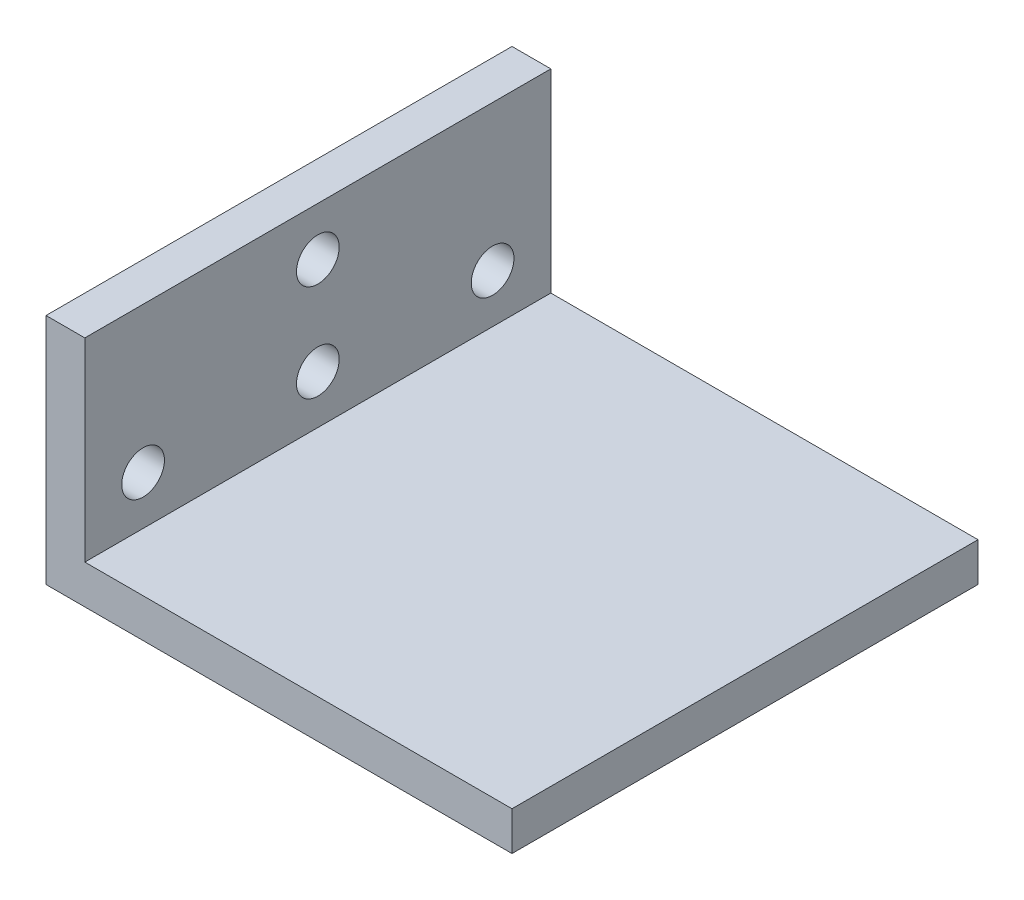
ISO-10303-21;
HEADER;
FILE_DESCRIPTION(('STEP AP214'),'2;1');
FILE_NAME('part.step','',(''),(''),'','','');
FILE_SCHEMA(('AUTOMOTIVE_DESIGN { 1 0 10303 214 1 1 1 1 }'));
ENDSEC;
DATA;
#1=APPLICATION_CONTEXT('core data for automotive mechanical design processes');
#2=APPLICATION_PROTOCOL_DEFINITION('international standard','automotive_design',2000,#1);
#3=PRODUCT_CONTEXT('',#1,'mechanical');
#4=PRODUCT('Part','Part','',(#3));
#5=PRODUCT_RELATED_PRODUCT_CATEGORY('part','',(#4));
#6=PRODUCT_DEFINITION_FORMATION('','',#4);
#7=PRODUCT_DEFINITION_CONTEXT('part definition',#1,'design');
#8=PRODUCT_DEFINITION('design','',#6,#7);
#9=PRODUCT_DEFINITION_SHAPE('','',#8);
#10=(LENGTH_UNIT() NAMED_UNIT(*) SI_UNIT(.MILLI.,.METRE.));
#11=(NAMED_UNIT(*) PLANE_ANGLE_UNIT() SI_UNIT($,.RADIAN.));
#12=(NAMED_UNIT(*) SI_UNIT($,.STERADIAN.) SOLID_ANGLE_UNIT());
#13=UNCERTAINTY_MEASURE_WITH_UNIT(LENGTH_MEASURE(1.E-05),#10,'distance_accuracy_value','');
#14=(GEOMETRIC_REPRESENTATION_CONTEXT(3) GLOBAL_UNCERTAINTY_ASSIGNED_CONTEXT((#13)) GLOBAL_UNIT_ASSIGNED_CONTEXT((#10,
#11,#12)) REPRESENTATION_CONTEXT('',''));
#15=CARTESIAN_POINT('',(0.,0.,0.));
#16=DIRECTION('',(0.,0.,1.));
#17=DIRECTION('',(1.,0.,0.));
#18=AXIS2_PLACEMENT_3D('',#15,#16,#17);
#19=CARTESIAN_POINT('',(0.,0.,0.));
#20=DIRECTION('',(0.,0.,-1.));
#21=DIRECTION('',(-1.,0.,0.));
#22=AXIS2_PLACEMENT_3D('',#19,#20,#21);
#23=PLANE('',#22);
#24=DIRECTION('',(1.,0.,0.));
#25=VECTOR('',#24,1.);
#26=CARTESIAN_POINT('',(152.4,0.,0.));
#27=LINE('',#26,#25);
#28=CARTESIAN_POINT('',(0.,0.,0.));
#29=VERTEX_POINT('',#28);
#30=CARTESIAN_POINT('',(152.4,0.,0.));
#31=VERTEX_POINT('',#30);
#32=EDGE_CURVE('E74',#29,#31,#27,.T.);
#33=ORIENTED_EDGE('',*,*,#32,.F.);
#34=DIRECTION('',(0.,-1.,0.));
#35=VECTOR('',#34,1.);
#36=CARTESIAN_POINT('',(0.,0.,0.));
#37=LINE('',#36,#35);
#38=CARTESIAN_POINT('',(0.,76.2,0.));
#39=VERTEX_POINT('',#38);
#40=EDGE_CURVE('E79',#39,#29,#37,.T.);
#41=ORIENTED_EDGE('',*,*,#40,.F.);
#42=DIRECTION('',(-1.,0.,0.));
#43=VECTOR('',#42,1.);
#44=CARTESIAN_POINT('',(0.,76.2,0.));
#45=LINE('',#44,#43);
#46=CARTESIAN_POINT('',(12.7,76.2,0.));
#47=VERTEX_POINT('',#46);
#48=EDGE_CURVE('E116',#47,#39,#45,.T.);
#49=ORIENTED_EDGE('',*,*,#48,.F.);
#50=DIRECTION('',(0.,1.,0.));
#51=VECTOR('',#50,1.);
#52=CARTESIAN_POINT('',(12.7,76.2,0.));
#53=LINE('',#52,#51);
#54=CARTESIAN_POINT('',(12.7,12.7,0.));
#55=VERTEX_POINT('',#54);
#56=EDGE_CURVE('E94',#55,#47,#53,.T.);
#57=ORIENTED_EDGE('',*,*,#56,.F.);
#58=DIRECTION('',(-1.,0.,0.));
#59=VECTOR('',#58,1.);
#60=CARTESIAN_POINT('',(12.7,12.7,0.));
#61=LINE('',#60,#59);
#62=CARTESIAN_POINT('',(152.4,12.7,0.));
#63=VERTEX_POINT('',#62);
#64=EDGE_CURVE('E92',#63,#55,#61,.T.);
#65=ORIENTED_EDGE('',*,*,#64,.F.);
#66=DIRECTION('',(0.,1.,0.));
#67=VECTOR('',#66,1.);
#68=CARTESIAN_POINT('',(152.4,12.7,0.));
#69=LINE('',#68,#67);
#70=EDGE_CURVE('E68',#31,#63,#69,.T.);
#71=ORIENTED_EDGE('',*,*,#70,.F.);
#72=EDGE_LOOP('',(#33,#41,#49,#57,#65,#71));
#73=FACE_BOUND('',#72,.T.);
#74=ADVANCED_FACE('F37',(#73),#23,.T.);
#75=CARTESIAN_POINT('',(0.,0.,152.4));
#76=DIRECTION('',(0.,0.,-1.));
#77=DIRECTION('',(-1.,0.,0.));
#78=AXIS2_PLACEMENT_3D('',#75,#76,#77);
#79=PLANE('',#78);
#80=DIRECTION('',(1.,0.,0.));
#81=VECTOR('',#80,1.);
#82=CARTESIAN_POINT('',(152.4,0.,152.4));
#83=LINE('',#82,#81);
#84=CARTESIAN_POINT('',(0.,0.,152.4));
#85=VERTEX_POINT('',#84);
#86=CARTESIAN_POINT('',(152.4,0.,152.4));
#87=VERTEX_POINT('',#86);
#88=EDGE_CURVE('E50',#85,#87,#83,.T.);
#89=ORIENTED_EDGE('',*,*,#88,.T.);
#90=DIRECTION('',(0.,1.,0.));
#91=VECTOR('',#90,1.);
#92=CARTESIAN_POINT('',(152.4,12.7,152.4));
#93=LINE('',#92,#91);
#94=CARTESIAN_POINT('',(152.4,12.7,152.4));
#95=VERTEX_POINT('',#94);
#96=EDGE_CURVE('E11',#87,#95,#93,.T.);
#97=ORIENTED_EDGE('',*,*,#96,.T.);
#98=DIRECTION('',(-1.,0.,0.));
#99=VECTOR('',#98,1.);
#100=CARTESIAN_POINT('',(12.7,12.7,152.4));
#101=LINE('',#100,#99);
#102=CARTESIAN_POINT('',(12.7,12.7,152.4));
#103=VERTEX_POINT('',#102);
#104=EDGE_CURVE('E109',#95,#103,#101,.T.);
#105=ORIENTED_EDGE('',*,*,#104,.T.);
#106=DIRECTION('',(0.,1.,0.));
#107=VECTOR('',#106,1.);
#108=CARTESIAN_POINT('',(12.7,76.2,152.4));
#109=LINE('',#108,#107);
#110=CARTESIAN_POINT('',(12.7,76.2,152.4));
#111=VERTEX_POINT('',#110);
#112=EDGE_CURVE('E117',#103,#111,#109,.T.);
#113=ORIENTED_EDGE('',*,*,#112,.T.);
#114=DIRECTION('',(-1.,0.,0.));
#115=VECTOR('',#114,1.);
#116=CARTESIAN_POINT('',(0.,76.2,152.4));
#117=LINE('',#116,#115);
#118=CARTESIAN_POINT('',(0.,76.2,152.4));
#119=VERTEX_POINT('',#118);
#120=EDGE_CURVE('E122',#111,#119,#117,.T.);
#121=ORIENTED_EDGE('',*,*,#120,.T.);
#122=DIRECTION('',(0.,-1.,0.));
#123=VECTOR('',#122,1.);
#124=CARTESIAN_POINT('',(0.,0.,152.4));
#125=LINE('',#124,#123);
#126=EDGE_CURVE('E56',#119,#85,#125,.T.);
#127=ORIENTED_EDGE('',*,*,#126,.T.);
#128=EDGE_LOOP('',(#89,#97,#105,#113,#121,#127));
#129=FACE_BOUND('',#128,.T.);
#130=ADVANCED_FACE('F148',(#129),#79,.F.);
#131=CARTESIAN_POINT('',(12.7,12.7,0.));
#132=DIRECTION('',(0.,1.,0.));
#133=DIRECTION('',(0.,0.,1.));
#134=AXIS2_PLACEMENT_3D('',#131,#132,#133);
#135=PLANE('',#134);
#136=DIRECTION('',(0.,0.,1.));
#137=VECTOR('',#136,1.);
#138=CARTESIAN_POINT('',(12.7,12.7,0.));
#139=LINE('',#138,#137);
#140=EDGE_CURVE('E111',#55,#103,#139,.T.);
#141=ORIENTED_EDGE('',*,*,#140,.T.);
#142=ORIENTED_EDGE('',*,*,#104,.F.);
#143=DIRECTION('',(0.,0.,1.));
#144=VECTOR('',#143,1.);
#145=CARTESIAN_POINT('',(152.4,12.7,0.));
#146=LINE('',#145,#144);
#147=EDGE_CURVE('E105',#63,#95,#146,.T.);
#148=ORIENTED_EDGE('',*,*,#147,.F.);
#149=ORIENTED_EDGE('',*,*,#64,.T.);
#150=EDGE_LOOP('',(#141,#142,#148,#149));
#151=FACE_BOUND('',#150,.T.);
#152=ADVANCED_FACE('F108',(#151),#135,.T.);
#153=CARTESIAN_POINT('',(12.7,76.2,0.));
#154=DIRECTION('',(1.,0.,0.));
#155=DIRECTION('',(0.,0.,-1.));
#156=AXIS2_PLACEMENT_3D('',#153,#154,#155);
#157=PLANE('',#156);
#158=CARTESIAN_POINT('',(12.7,28.575,19.05));
#159=DIRECTION('',(1.,0.,0.));
#160=DIRECTION('',(0.,0.,-1.));
#161=AXIS2_PLACEMENT_3D('',#158,#159,#160);
#162=CIRCLE('',#161,6.985);
#163=CARTESIAN_POINT('',(12.7,28.575,12.065));
#164=VERTEX_POINT('',#163);
#165=EDGE_CURVE('E190',#164,#164,#162,.T.);
#166=ORIENTED_EDGE('',*,*,#165,.F.);
#167=EDGE_LOOP('',(#166));
#168=FACE_BOUND('',#167,.T.);
#169=CARTESIAN_POINT('',(12.7,28.575,76.2));
#170=DIRECTION('',(1.,0.,0.));
#171=DIRECTION('',(0.,0.,-1.));
#172=AXIS2_PLACEMENT_3D('',#169,#170,#171);
#173=CIRCLE('',#172,6.98500000000001);
#174=CARTESIAN_POINT('',(12.7,28.575,69.2149999999999));
#175=VERTEX_POINT('',#174);
#176=EDGE_CURVE('E197',#175,#175,#173,.T.);
#177=ORIENTED_EDGE('',*,*,#176,.F.);
#178=EDGE_LOOP('',(#177));
#179=FACE_BOUND('',#178,.T.);
#180=CARTESIAN_POINT('',(12.7,28.575,133.35));
#181=DIRECTION('',(1.,0.,0.));
#182=DIRECTION('',(0.,0.,-1.));
#183=AXIS2_PLACEMENT_3D('',#180,#181,#182);
#184=CIRCLE('',#183,6.98499999999998);
#185=CARTESIAN_POINT('',(12.7,28.575,126.365));
#186=VERTEX_POINT('',#185);
#187=EDGE_CURVE('E203',#186,#186,#184,.T.);
#188=ORIENTED_EDGE('',*,*,#187,.F.);
#189=EDGE_LOOP('',(#188));
#190=FACE_BOUND('',#189,.T.);
#191=CARTESIAN_POINT('',(12.7,60.325,76.2));
#192=DIRECTION('',(1.,0.,0.));
#193=DIRECTION('',(0.,0.,-1.));
#194=AXIS2_PLACEMENT_3D('',#191,#192,#193);
#195=CIRCLE('',#194,6.98500000000001);
#196=CARTESIAN_POINT('',(12.7,60.325,69.2149999999999));
#197=VERTEX_POINT('',#196);
#198=EDGE_CURVE('E204',#197,#197,#195,.T.);
#199=ORIENTED_EDGE('',*,*,#198,.F.);
#200=EDGE_LOOP('',(#199));
#201=FACE_BOUND('',#200,.T.);
#202=DIRECTION('',(0.,0.,1.));
#203=VECTOR('',#202,1.);
#204=CARTESIAN_POINT('',(12.7,76.2,0.));
#205=LINE('',#204,#203);
#206=EDGE_CURVE('E119',#47,#111,#205,.T.);
#207=ORIENTED_EDGE('',*,*,#206,.T.);
#208=ORIENTED_EDGE('',*,*,#112,.F.);
#209=ORIENTED_EDGE('',*,*,#140,.F.);
#210=ORIENTED_EDGE('',*,*,#56,.T.);
#211=EDGE_LOOP('',(#207,#208,#209,#210));
#212=FACE_BOUND('',#211,.T.);
#213=ADVANCED_FACE('F146',(#168,#179,#190,#201,#212),#157,.T.);
#214=CARTESIAN_POINT('',(0.,76.2,0.));
#215=DIRECTION('',(0.,1.,0.));
#216=DIRECTION('',(0.,0.,1.));
#217=AXIS2_PLACEMENT_3D('',#214,#215,#216);
#218=PLANE('',#217);
#219=DIRECTION('',(0.,0.,1.));
#220=VECTOR('',#219,1.);
#221=CARTESIAN_POINT('',(0.,76.2,0.));
#222=LINE('',#221,#220);
#223=EDGE_CURVE('E125',#39,#119,#222,.T.);
#224=ORIENTED_EDGE('',*,*,#223,.T.);
#225=ORIENTED_EDGE('',*,*,#120,.F.);
#226=ORIENTED_EDGE('',*,*,#206,.F.);
#227=ORIENTED_EDGE('',*,*,#48,.T.);
#228=EDGE_LOOP('',(#224,#225,#226,#227));
#229=FACE_BOUND('',#228,.T.);
#230=ADVANCED_FACE('F143',(#229),#218,.T.);
#231=CARTESIAN_POINT('',(0.,0.,0.));
#232=DIRECTION('',(-1.,0.,0.));
#233=DIRECTION('',(0.,0.,1.));
#234=AXIS2_PLACEMENT_3D('',#231,#232,#233);
#235=PLANE('',#234);
#236=CARTESIAN_POINT('',(0.,28.575,19.05));
#237=DIRECTION('',(-1.,0.,0.));
#238=DIRECTION('',(0.,0.,1.));
#239=AXIS2_PLACEMENT_3D('',#236,#237,#238);
#240=CIRCLE('',#239,6.985);
#241=CARTESIAN_POINT('',(0.,28.575,26.035));
#242=VERTEX_POINT('',#241);
#243=EDGE_CURVE('E99',#242,#242,#240,.F.);
#244=ORIENTED_EDGE('',*,*,#243,.T.);
#245=EDGE_LOOP('',(#244));
#246=FACE_BOUND('',#245,.T.);
#247=CARTESIAN_POINT('',(0.,28.575,76.2));
#248=DIRECTION('',(-1.,0.,0.));
#249=DIRECTION('',(0.,0.,1.));
#250=AXIS2_PLACEMENT_3D('',#247,#248,#249);
#251=CIRCLE('',#250,6.98500000000001);
#252=CARTESIAN_POINT('',(0.,28.575,83.185));
#253=VERTEX_POINT('',#252);
#254=EDGE_CURVE('E200',#253,#253,#251,.F.);
#255=ORIENTED_EDGE('',*,*,#254,.T.);
#256=EDGE_LOOP('',(#255));
#257=FACE_BOUND('',#256,.T.);
#258=CARTESIAN_POINT('',(0.,28.575,133.35));
#259=DIRECTION('',(-1.,0.,0.));
#260=DIRECTION('',(0.,0.,1.));
#261=AXIS2_PLACEMENT_3D('',#258,#259,#260);
#262=CIRCLE('',#261,6.98499999999998);
#263=CARTESIAN_POINT('',(0.,28.575,140.335));
#264=VERTEX_POINT('',#263);
#265=EDGE_CURVE('E207',#264,#264,#262,.F.);
#266=ORIENTED_EDGE('',*,*,#265,.T.);
#267=EDGE_LOOP('',(#266));
#268=FACE_BOUND('',#267,.T.);
#269=CARTESIAN_POINT('',(0.,60.325,76.2));
#270=DIRECTION('',(-1.,0.,0.));
#271=DIRECTION('',(0.,0.,1.));
#272=AXIS2_PLACEMENT_3D('',#269,#270,#271);
#273=CIRCLE('',#272,6.98500000000001);
#274=CARTESIAN_POINT('',(0.,60.325,83.185));
#275=VERTEX_POINT('',#274);
#276=EDGE_CURVE('E194',#275,#275,#273,.F.);
#277=ORIENTED_EDGE('',*,*,#276,.T.);
#278=EDGE_LOOP('',(#277));
#279=FACE_BOUND('',#278,.T.);
#280=DIRECTION('',(0.,0.,1.));
#281=VECTOR('',#280,1.);
#282=CARTESIAN_POINT('',(0.,0.,0.));
#283=LINE('',#282,#281);
#284=EDGE_CURVE('E130',#29,#85,#283,.T.);
#285=ORIENTED_EDGE('',*,*,#284,.T.);
#286=ORIENTED_EDGE('',*,*,#126,.F.);
#287=ORIENTED_EDGE('',*,*,#223,.F.);
#288=ORIENTED_EDGE('',*,*,#40,.T.);
#289=EDGE_LOOP('',(#285,#286,#287,#288));
#290=FACE_BOUND('',#289,.T.);
#291=ADVANCED_FACE('F139',(#246,#257,#268,#279,#290),#235,.T.);
#292=CARTESIAN_POINT('',(152.4,0.,0.));
#293=DIRECTION('',(0.,-1.,0.));
#294=DIRECTION('',(1.,0.,0.));
#295=AXIS2_PLACEMENT_3D('',#292,#293,#294);
#296=PLANE('',#295);
#297=DIRECTION('',(0.,0.,1.));
#298=VECTOR('',#297,1.);
#299=CARTESIAN_POINT('',(152.4,0.,0.));
#300=LINE('',#299,#298);
#301=EDGE_CURVE('E44',#31,#87,#300,.T.);
#302=ORIENTED_EDGE('',*,*,#301,.T.);
#303=ORIENTED_EDGE('',*,*,#88,.F.);
#304=ORIENTED_EDGE('',*,*,#284,.F.);
#305=ORIENTED_EDGE('',*,*,#32,.T.);
#306=EDGE_LOOP('',(#302,#303,#304,#305));
#307=FACE_BOUND('',#306,.T.);
#308=ADVANCED_FACE('F136',(#307),#296,.T.);
#309=CARTESIAN_POINT('',(152.4,12.7,0.));
#310=DIRECTION('',(1.,0.,0.));
#311=DIRECTION('',(0.,0.,-1.));
#312=AXIS2_PLACEMENT_3D('',#309,#310,#311);
#313=PLANE('',#312);
#314=ORIENTED_EDGE('',*,*,#96,.F.);
#315=ORIENTED_EDGE('',*,*,#301,.F.);
#316=ORIENTED_EDGE('',*,*,#70,.T.);
#317=ORIENTED_EDGE('',*,*,#147,.T.);
#318=EDGE_LOOP('',(#314,#315,#316,#317));
#319=FACE_BOUND('',#318,.T.);
#320=ADVANCED_FACE('F104',(#319),#313,.T.);
#321=CARTESIAN_POINT('',(-19.7565634663522,60.325,76.2));
#322=DIRECTION('',(1.,0.,0.));
#323=DIRECTION('',(0.,0.,-1.));
#324=AXIS2_PLACEMENT_3D('',#321,#322,#323);
#325=CYLINDRICAL_SURFACE('',#324,6.98500000000001);
#326=ORIENTED_EDGE('',*,*,#198,.T.);
#327=EDGE_LOOP('',(#326));
#328=FACE_BOUND('',#327,.T.);
#329=ORIENTED_EDGE('',*,*,#276,.F.);
#330=EDGE_LOOP('',(#329));
#331=FACE_BOUND('',#330,.T.);
#332=ADVANCED_FACE('F155',(#328,#331),#325,.F.);
#333=CARTESIAN_POINT('',(-19.7565634663522,28.575,133.35));
#334=DIRECTION('',(1.,0.,0.));
#335=DIRECTION('',(0.,0.,-1.));
#336=AXIS2_PLACEMENT_3D('',#333,#334,#335);
#337=CYLINDRICAL_SURFACE('',#336,6.98499999999998);
#338=ORIENTED_EDGE('',*,*,#187,.T.);
#339=EDGE_LOOP('',(#338));
#340=FACE_BOUND('',#339,.T.);
#341=ORIENTED_EDGE('',*,*,#265,.F.);
#342=EDGE_LOOP('',(#341));
#343=FACE_BOUND('',#342,.T.);
#344=ADVANCED_FACE('F162',(#340,#343),#337,.F.);
#345=CARTESIAN_POINT('',(-19.7565634663522,28.575,76.2));
#346=DIRECTION('',(1.,0.,0.));
#347=DIRECTION('',(0.,0.,-1.));
#348=AXIS2_PLACEMENT_3D('',#345,#346,#347);
#349=CYLINDRICAL_SURFACE('',#348,6.98500000000001);
#350=ORIENTED_EDGE('',*,*,#176,.T.);
#351=EDGE_LOOP('',(#350));
#352=FACE_BOUND('',#351,.T.);
#353=ORIENTED_EDGE('',*,*,#254,.F.);
#354=EDGE_LOOP('',(#353));
#355=FACE_BOUND('',#354,.T.);
#356=ADVANCED_FACE('F176',(#352,#355),#349,.F.);
#357=CARTESIAN_POINT('',(-19.7565634663522,28.575,19.05));
#358=DIRECTION('',(1.,0.,0.));
#359=DIRECTION('',(0.,0.,-1.));
#360=AXIS2_PLACEMENT_3D('',#357,#358,#359);
#361=CYLINDRICAL_SURFACE('',#360,6.985);
#362=ORIENTED_EDGE('',*,*,#165,.T.);
#363=EDGE_LOOP('',(#362));
#364=FACE_BOUND('',#363,.T.);
#365=ORIENTED_EDGE('',*,*,#243,.F.);
#366=EDGE_LOOP('',(#365));
#367=FACE_BOUND('',#366,.T.);
#368=ADVANCED_FACE('F181',(#364,#367),#361,.F.);
#369=CLOSED_SHELL('',(#74,#130,#152,#213,#230,#291,#308,#320,#332,#344,#356,#368));
#370=MANIFOLD_SOLID_BREP('B2',#369);
#371=ADVANCED_BREP_SHAPE_REPRESENTATION('',(#18,#370),#14);
#372=SHAPE_DEFINITION_REPRESENTATION(#9,#371);
ENDSEC;
END-ISO-10303-21;
